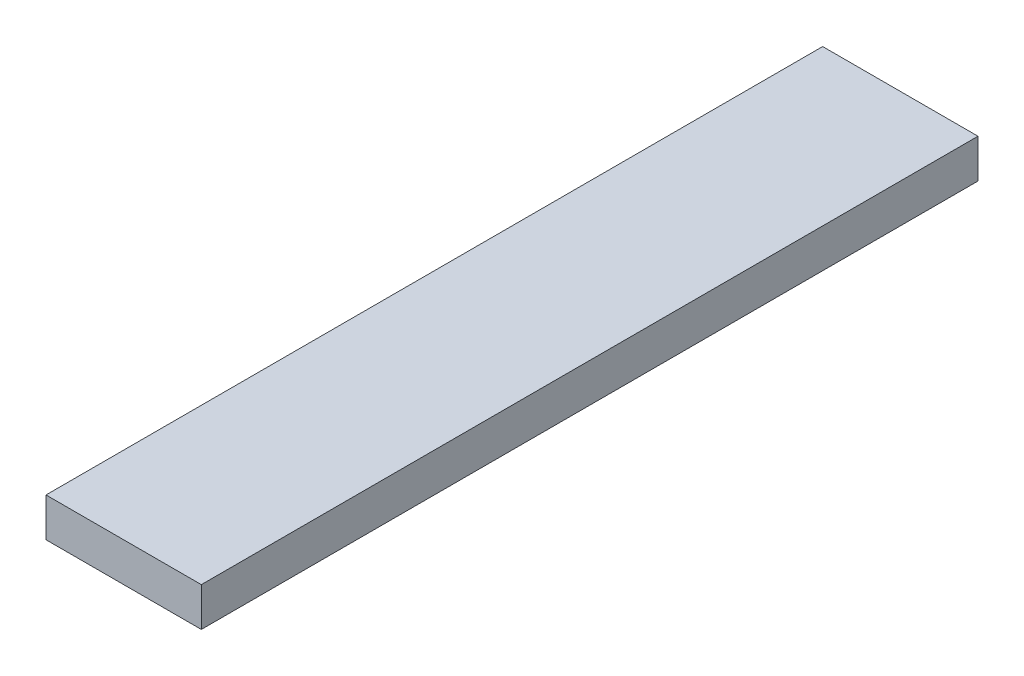
ISO-10303-21;
HEADER;
FILE_DESCRIPTION(('STEP AP214'),'2;1');
FILE_NAME('part.step','',(''),(''),'','','');
FILE_SCHEMA(('AUTOMOTIVE_DESIGN { 1 0 10303 214 1 1 1 1 }'));
ENDSEC;
DATA;
#1=APPLICATION_CONTEXT('core data for automotive mechanical design processes');
#2=APPLICATION_PROTOCOL_DEFINITION('international standard','automotive_design',2000,#1);
#3=PRODUCT_CONTEXT('',#1,'mechanical');
#4=PRODUCT('Part','Part','',(#3));
#5=PRODUCT_RELATED_PRODUCT_CATEGORY('part','',(#4));
#6=PRODUCT_DEFINITION_FORMATION('','',#4);
#7=PRODUCT_DEFINITION_CONTEXT('part definition',#1,'design');
#8=PRODUCT_DEFINITION('design','',#6,#7);
#9=PRODUCT_DEFINITION_SHAPE('','',#8);
#10=(LENGTH_UNIT() NAMED_UNIT(*) SI_UNIT(.MILLI.,.METRE.));
#11=(NAMED_UNIT(*) PLANE_ANGLE_UNIT() SI_UNIT($,.RADIAN.));
#12=(NAMED_UNIT(*) SI_UNIT($,.STERADIAN.) SOLID_ANGLE_UNIT());
#13=UNCERTAINTY_MEASURE_WITH_UNIT(LENGTH_MEASURE(1.E-05),#10,'distance_accuracy_value','');
#14=(GEOMETRIC_REPRESENTATION_CONTEXT(3) GLOBAL_UNCERTAINTY_ASSIGNED_CONTEXT((#13)) GLOBAL_UNIT_ASSIGNED_CONTEXT((#10,
#11,#12)) REPRESENTATION_CONTEXT('',''));
#15=CARTESIAN_POINT('',(0.,0.,0.));
#16=DIRECTION('',(0.,0.,1.));
#17=DIRECTION('',(1.,0.,0.));
#18=AXIS2_PLACEMENT_3D('',#15,#16,#17);
#19=CARTESIAN_POINT('',(0.,1.,0.));
#20=DIRECTION('',(1.,0.,0.));
#21=DIRECTION('',(0.,0.,-1.));
#22=AXIS2_PLACEMENT_3D('',#19,#20,#21);
#23=PLANE('',#22);
#24=DIRECTION('',(0.,0.,1.));
#25=VECTOR('',#24,1.);
#26=CARTESIAN_POINT('',(0.,0.,0.));
#27=LINE('',#26,#25);
#28=CARTESIAN_POINT('',(0.,0.,-20.));
#29=VERTEX_POINT('',#28);
#30=CARTESIAN_POINT('',(0.,0.,0.));
#31=VERTEX_POINT('',#30);
#32=EDGE_CURVE('E111',#29,#31,#27,.T.);
#33=ORIENTED_EDGE('',*,*,#32,.T.);
#34=DIRECTION('',(0.,-1.,0.));
#35=VECTOR('',#34,1.);
#36=CARTESIAN_POINT('',(0.,1.,0.));
#37=LINE('',#36,#35);
#38=CARTESIAN_POINT('',(0.,1.,0.));
#39=VERTEX_POINT('',#38);
#40=EDGE_CURVE('E11',#39,#31,#37,.T.);
#41=ORIENTED_EDGE('',*,*,#40,.F.);
#42=DIRECTION('',(0.,0.,1.));
#43=VECTOR('',#42,1.);
#44=CARTESIAN_POINT('',(0.,1.,0.));
#45=LINE('',#44,#43);
#46=CARTESIAN_POINT('',(0.,1.,-20.));
#47=VERTEX_POINT('',#46);
#48=EDGE_CURVE('E100',#47,#39,#45,.T.);
#49=ORIENTED_EDGE('',*,*,#48,.F.);
#50=DIRECTION('',(0.,-1.,0.));
#51=VECTOR('',#50,1.);
#52=CARTESIAN_POINT('',(0.,1.,-20.));
#53=LINE('',#52,#51);
#54=EDGE_CURVE('E110',#47,#29,#53,.T.);
#55=ORIENTED_EDGE('',*,*,#54,.T.);
#56=EDGE_LOOP('',(#33,#41,#49,#55));
#57=FACE_BOUND('',#56,.T.);
#58=ADVANCED_FACE('F44',(#57),#23,.F.);
#59=CARTESIAN_POINT('',(0.,1.,0.));
#60=DIRECTION('',(0.,0.,-1.));
#61=DIRECTION('',(-1.,0.,0.));
#62=AXIS2_PLACEMENT_3D('',#59,#60,#61);
#63=PLANE('',#62);
#64=DIRECTION('',(1.,0.,0.));
#65=VECTOR('',#64,1.);
#66=CARTESIAN_POINT('',(0.,0.,0.));
#67=LINE('',#66,#65);
#68=CARTESIAN_POINT('',(4.,0.,0.));
#69=VERTEX_POINT('',#68);
#70=EDGE_CURVE('E105',#31,#69,#67,.T.);
#71=ORIENTED_EDGE('',*,*,#70,.T.);
#72=DIRECTION('',(0.,-1.,0.));
#73=VECTOR('',#72,1.);
#74=CARTESIAN_POINT('',(4.,1.,0.));
#75=LINE('',#74,#73);
#76=CARTESIAN_POINT('',(4.,1.,0.));
#77=VERTEX_POINT('',#76);
#78=EDGE_CURVE('E53',#77,#69,#75,.T.);
#79=ORIENTED_EDGE('',*,*,#78,.F.);
#80=DIRECTION('',(1.,0.,0.));
#81=VECTOR('',#80,1.);
#82=CARTESIAN_POINT('',(0.,1.,0.));
#83=LINE('',#82,#81);
#84=EDGE_CURVE('E95',#39,#77,#83,.T.);
#85=ORIENTED_EDGE('',*,*,#84,.F.);
#86=ORIENTED_EDGE('',*,*,#40,.T.);
#87=EDGE_LOOP('',(#71,#79,#85,#86));
#88=FACE_BOUND('',#87,.T.);
#89=ADVANCED_FACE('F102',(#88),#63,.F.);
#90=CARTESIAN_POINT('',(4.,1.,0.));
#91=DIRECTION('',(-1.,0.,0.));
#92=DIRECTION('',(0.,0.,1.));
#93=AXIS2_PLACEMENT_3D('',#90,#91,#92);
#94=PLANE('',#93);
#95=DIRECTION('',(0.,0.,-1.));
#96=VECTOR('',#95,1.);
#97=CARTESIAN_POINT('',(4.,0.,0.));
#98=LINE('',#97,#96);
#99=CARTESIAN_POINT('',(4.,0.,-20.));
#100=VERTEX_POINT('',#99);
#101=EDGE_CURVE('E80',#69,#100,#98,.T.);
#102=ORIENTED_EDGE('',*,*,#101,.T.);
#103=DIRECTION('',(0.,-1.,0.));
#104=VECTOR('',#103,1.);
#105=CARTESIAN_POINT('',(4.,1.,-20.));
#106=LINE('',#105,#104);
#107=CARTESIAN_POINT('',(4.,1.,-20.));
#108=VERTEX_POINT('',#107);
#109=EDGE_CURVE('E101',#108,#100,#106,.T.);
#110=ORIENTED_EDGE('',*,*,#109,.F.);
#111=DIRECTION('',(0.,0.,-1.));
#112=VECTOR('',#111,1.);
#113=CARTESIAN_POINT('',(4.,1.,0.));
#114=LINE('',#113,#112);
#115=EDGE_CURVE('E94',#77,#108,#114,.T.);
#116=ORIENTED_EDGE('',*,*,#115,.F.);
#117=ORIENTED_EDGE('',*,*,#78,.T.);
#118=EDGE_LOOP('',(#102,#110,#116,#117));
#119=FACE_BOUND('',#118,.T.);
#120=ADVANCED_FACE('F103',(#119),#94,.F.);
#121=CARTESIAN_POINT('',(0.,1.,-20.));
#122=DIRECTION('',(0.,0.,1.));
#123=DIRECTION('',(1.,0.,0.));
#124=AXIS2_PLACEMENT_3D('',#121,#122,#123);
#125=PLANE('',#124);
#126=DIRECTION('',(-1.,0.,0.));
#127=VECTOR('',#126,1.);
#128=CARTESIAN_POINT('',(0.,0.,-20.));
#129=LINE('',#128,#127);
#130=EDGE_CURVE('E82',#100,#29,#129,.T.);
#131=ORIENTED_EDGE('',*,*,#130,.T.);
#132=ORIENTED_EDGE('',*,*,#54,.F.);
#133=DIRECTION('',(-1.,0.,0.));
#134=VECTOR('',#133,1.);
#135=CARTESIAN_POINT('',(0.,1.,-20.));
#136=LINE('',#135,#134);
#137=EDGE_CURVE('E64',#108,#47,#136,.T.);
#138=ORIENTED_EDGE('',*,*,#137,.F.);
#139=ORIENTED_EDGE('',*,*,#109,.T.);
#140=EDGE_LOOP('',(#131,#132,#138,#139));
#141=FACE_BOUND('',#140,.T.);
#142=ADVANCED_FACE('F128',(#141),#125,.F.);
#143=CARTESIAN_POINT('',(0.,1.,0.));
#144=DIRECTION('',(0.,-1.,0.));
#145=DIRECTION('',(0.,0.,-1.));
#146=AXIS2_PLACEMENT_3D('',#143,#144,#145);
#147=PLANE('',#146);
#148=ORIENTED_EDGE('',*,*,#48,.T.);
#149=ORIENTED_EDGE('',*,*,#84,.T.);
#150=ORIENTED_EDGE('',*,*,#115,.T.);
#151=ORIENTED_EDGE('',*,*,#137,.T.);
#152=EDGE_LOOP('',(#148,#149,#150,#151));
#153=FACE_BOUND('',#152,.T.);
#154=ADVANCED_FACE('F93',(#153),#147,.F.);
#155=CARTESIAN_POINT('',(0.,0.,0.));
#156=DIRECTION('',(0.,-1.,0.));
#157=DIRECTION('',(0.,0.,-1.));
#158=AXIS2_PLACEMENT_3D('',#155,#156,#157);
#159=PLANE('',#158);
#160=ORIENTED_EDGE('',*,*,#32,.F.);
#161=ORIENTED_EDGE('',*,*,#130,.F.);
#162=ORIENTED_EDGE('',*,*,#101,.F.);
#163=ORIENTED_EDGE('',*,*,#70,.F.);
#164=EDGE_LOOP('',(#160,#161,#162,#163));
#165=FACE_BOUND('',#164,.T.);
#166=ADVANCED_FACE('F129',(#165),#159,.T.);
#167=CLOSED_SHELL('',(#58,#89,#120,#142,#154,#166));
#168=MANIFOLD_SOLID_BREP('B2',#167);
#169=ADVANCED_BREP_SHAPE_REPRESENTATION('',(#18,#168),#14);
#170=SHAPE_DEFINITION_REPRESENTATION(#9,#169);
ENDSEC;
END-ISO-10303-21;
